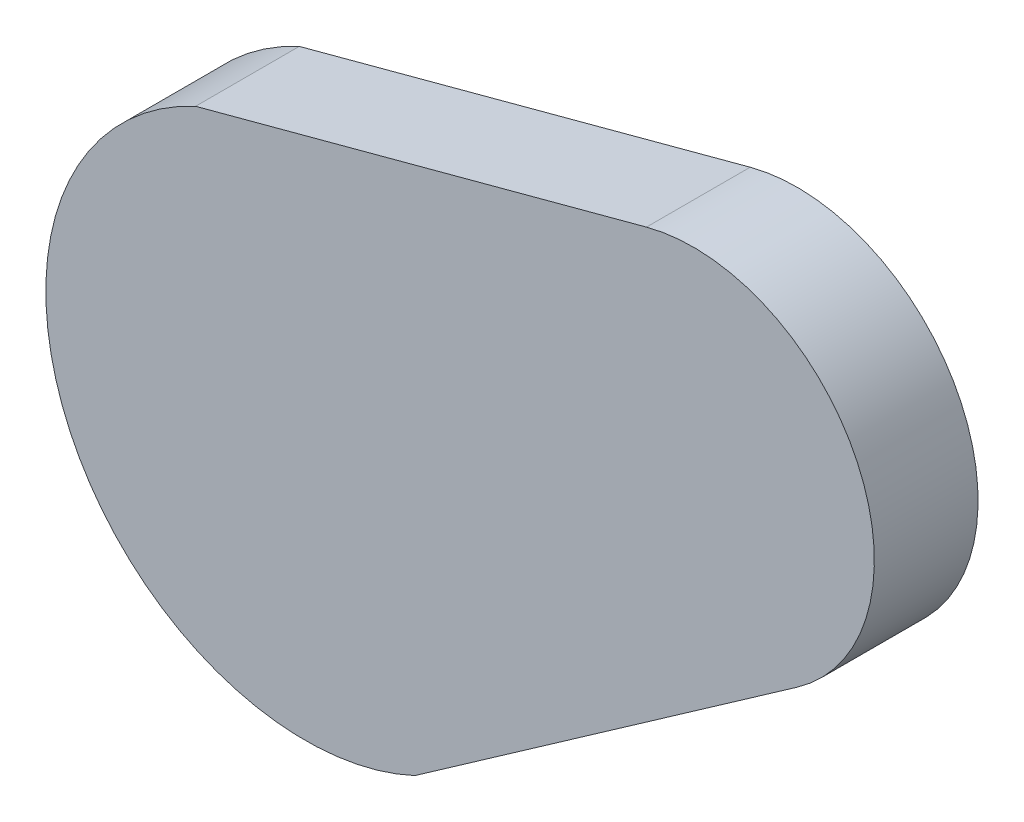
ISO-10303-21;
HEADER;
FILE_DESCRIPTION(('STEP AP214'),'2;1');
FILE_NAME('part.step','',(''),(''),'','','');
FILE_SCHEMA(('AUTOMOTIVE_DESIGN { 1 0 10303 214 1 1 1 1 }'));
ENDSEC;
DATA;
#1=APPLICATION_CONTEXT('core data for automotive mechanical design processes');
#2=APPLICATION_PROTOCOL_DEFINITION('international standard','automotive_design',2000,#1);
#3=PRODUCT_CONTEXT('',#1,'mechanical');
#4=PRODUCT('Part','Part','',(#3));
#5=PRODUCT_RELATED_PRODUCT_CATEGORY('part','',(#4));
#6=PRODUCT_DEFINITION_FORMATION('','',#4);
#7=PRODUCT_DEFINITION_CONTEXT('part definition',#1,'design');
#8=PRODUCT_DEFINITION('design','',#6,#7);
#9=PRODUCT_DEFINITION_SHAPE('','',#8);
#10=(LENGTH_UNIT() NAMED_UNIT(*) SI_UNIT(.MILLI.,.METRE.));
#11=(NAMED_UNIT(*) PLANE_ANGLE_UNIT() SI_UNIT($,.RADIAN.));
#12=(NAMED_UNIT(*) SI_UNIT($,.STERADIAN.) SOLID_ANGLE_UNIT());
#13=UNCERTAINTY_MEASURE_WITH_UNIT(LENGTH_MEASURE(1.E-05),#10,'distance_accuracy_value','');
#14=(GEOMETRIC_REPRESENTATION_CONTEXT(3) GLOBAL_UNCERTAINTY_ASSIGNED_CONTEXT((#13)) GLOBAL_UNIT_ASSIGNED_CONTEXT((#10,
#11,#12)) REPRESENTATION_CONTEXT('',''));
#15=CARTESIAN_POINT('',(0.,0.,0.));
#16=DIRECTION('',(0.,0.,1.));
#17=DIRECTION('',(1.,0.,0.));
#18=AXIS2_PLACEMENT_3D('',#15,#16,#17);
#19=CARTESIAN_POINT('',(0.,-80.,20.));
#20=DIRECTION('',(0.,0.,-1.));
#21=DIRECTION('',(-1.,0.,0.));
#22=AXIS2_PLACEMENT_3D('',#19,#20,#21);
#23=CYLINDRICAL_SURFACE('',#22,25.);
#24=CARTESIAN_POINT('',(0.,-80.,10.));
#25=DIRECTION('',(0.,0.,1.));
#26=DIRECTION('',(-1.,0.,0.));
#27=AXIS2_PLACEMENT_3D('',#24,#25,#26);
#28=CIRCLE('',#27,25.);
#29=CARTESIAN_POINT('',(-10.5654565435175,-57.3423053240838,10.));
#30=VERTEX_POINT('',#29);
#31=CARTESIAN_POINT('',(10.5654565435175,-102.657694675916,10.));
#32=VERTEX_POINT('',#31);
#33=EDGE_CURVE('E98',#30,#32,#28,.T.);
#34=ORIENTED_EDGE('',*,*,#33,.T.);
#35=DIRECTION('',(0.,0.,-1.));
#36=VECTOR('',#35,1.);
#37=CARTESIAN_POINT('',(10.5654565435175,-102.657694675916,20.));
#38=LINE('',#37,#36);
#39=CARTESIAN_POINT('',(10.5654565435175,-102.657694675916,20.));
#40=VERTEX_POINT('',#39);
#41=EDGE_CURVE('E11',#40,#32,#38,.T.);
#42=ORIENTED_EDGE('',*,*,#41,.F.);
#43=CARTESIAN_POINT('',(0.,-80.,20.));
#44=DIRECTION('',(0.,0.,1.));
#45=DIRECTION('',(-1.,0.,0.));
#46=AXIS2_PLACEMENT_3D('',#43,#44,#45);
#47=CIRCLE('',#46,25.);
#48=CARTESIAN_POINT('',(-10.5654565435175,-57.3423053240838,20.));
#49=VERTEX_POINT('',#48);
#50=EDGE_CURVE('E86',#49,#40,#47,.T.);
#51=ORIENTED_EDGE('',*,*,#50,.F.);
#52=DIRECTION('',(0.,0.,-1.));
#53=VECTOR('',#52,1.);
#54=CARTESIAN_POINT('',(-10.5654565435175,-57.3423053240838,20.));
#55=LINE('',#54,#53);
#56=EDGE_CURVE('E94',#49,#30,#55,.T.);
#57=ORIENTED_EDGE('',*,*,#56,.T.);
#58=EDGE_LOOP('',(#34,#42,#51,#57));
#59=FACE_BOUND('',#58,.T.);
#60=ADVANCED_FACE('F35',(#59),#23,.T.);
#61=CARTESIAN_POINT('',(10.5654565435175,-102.657694675916,20.));
#62=DIRECTION('',(-0.573576436351051,0.819152044288988,0.));
#63=DIRECTION('',(-0.819152044288988,-0.573576436351051,0.));
#64=AXIS2_PLACEMENT_3D('',#61,#62,#63);
#65=PLANE('',#64);
#66=DIRECTION('',(0.819152044288988,0.573576436351051,0.));
#67=VECTOR('',#66,1.);
#68=CARTESIAN_POINT('',(10.5654565435175,-102.657694675916,10.));
#69=LINE('',#68,#67);
#70=CARTESIAN_POINT('',(47.427298536522,-76.8467550401189,10.));
#71=VERTEX_POINT('',#70);
#72=EDGE_CURVE('E90',#32,#71,#69,.T.);
#73=ORIENTED_EDGE('',*,*,#72,.T.);
#74=DIRECTION('',(0.,0.,-1.));
#75=VECTOR('',#74,1.);
#76=CARTESIAN_POINT('',(47.427298536522,-76.8467550401189,20.));
#77=LINE('',#76,#75);
#78=CARTESIAN_POINT('',(47.427298536522,-76.8467550401189,20.));
#79=VERTEX_POINT('',#78);
#80=EDGE_CURVE('E43',#79,#71,#77,.T.);
#81=ORIENTED_EDGE('',*,*,#80,.F.);
#82=DIRECTION('',(0.819152044288988,0.573576436351051,0.));
#83=VECTOR('',#82,1.);
#84=CARTESIAN_POINT('',(10.5654565435175,-102.657694675916,20.));
#85=LINE('',#84,#83);
#86=EDGE_CURVE('E81',#40,#79,#85,.T.);
#87=ORIENTED_EDGE('',*,*,#86,.F.);
#88=ORIENTED_EDGE('',*,*,#41,.T.);
#89=EDGE_LOOP('',(#73,#81,#87,#88));
#90=FACE_BOUND('',#89,.T.);
#91=ADVANCED_FACE('F89',(#90),#65,.F.);
#92=CARTESIAN_POINT('',(37.4178441562144,-62.5517727183067,20.));
#93=DIRECTION('',(0.,0.,-1.));
#94=DIRECTION('',(-1.,0.,0.));
#95=AXIS2_PLACEMENT_3D('',#92,#93,#94);
#96=CYLINDRICAL_SURFACE('',#95,17.4509511652627);
#97=CARTESIAN_POINT('',(37.4178441562144,-62.5517727183067,10.));
#98=DIRECTION('',(0.,0.,1.));
#99=DIRECTION('',(1.,0.,0.));
#100=AXIS2_PLACEMENT_3D('',#97,#98,#99);
#101=CIRCLE('',#100,17.4509511652627);
#102=CARTESIAN_POINT('',(32.9012056394903,-45.6954482944702,10.));
#103=VERTEX_POINT('',#102);
#104=EDGE_CURVE('E68',#71,#103,#101,.T.);
#105=ORIENTED_EDGE('',*,*,#104,.T.);
#106=DIRECTION('',(0.,0.,-1.));
#107=VECTOR('',#106,1.);
#108=CARTESIAN_POINT('',(32.9012056394903,-45.6954482944702,20.));
#109=LINE('',#108,#107);
#110=CARTESIAN_POINT('',(32.9012056394903,-45.6954482944702,20.));
#111=VERTEX_POINT('',#110);
#112=EDGE_CURVE('E91',#111,#103,#109,.T.);
#113=ORIENTED_EDGE('',*,*,#112,.F.);
#114=CARTESIAN_POINT('',(37.4178441562144,-62.5517727183067,20.));
#115=DIRECTION('',(0.,0.,1.));
#116=DIRECTION('',(1.,0.,0.));
#117=AXIS2_PLACEMENT_3D('',#114,#115,#116);
#118=CIRCLE('',#117,17.4509511652627);
#119=EDGE_CURVE('E84',#79,#111,#118,.T.);
#120=ORIENTED_EDGE('',*,*,#119,.F.);
#121=ORIENTED_EDGE('',*,*,#80,.T.);
#122=EDGE_LOOP('',(#105,#113,#120,#121));
#123=FACE_BOUND('',#122,.T.);
#124=ADVANCED_FACE('F92',(#123),#96,.T.);
#125=CARTESIAN_POINT('',(-10.5654565435175,-57.3423053240838,20.));
#126=DIRECTION('',(0.258819045102525,-0.965925826289067,0.));
#127=DIRECTION('',(0.965925826289067,0.258819045102525,0.));
#128=AXIS2_PLACEMENT_3D('',#125,#126,#127);
#129=PLANE('',#128);
#130=DIRECTION('',(-0.965925826289067,-0.258819045102525,0.));
#131=VECTOR('',#130,1.);
#132=CARTESIAN_POINT('',(-10.5654565435175,-57.3423053240838,10.));
#133=LINE('',#132,#131);
#134=EDGE_CURVE('E74',#103,#30,#133,.T.);
#135=ORIENTED_EDGE('',*,*,#134,.T.);
#136=ORIENTED_EDGE('',*,*,#56,.F.);
#137=DIRECTION('',(-0.965925826289067,-0.258819045102525,0.));
#138=VECTOR('',#137,1.);
#139=CARTESIAN_POINT('',(-10.5654565435175,-57.3423053240838,20.));
#140=LINE('',#139,#138);
#141=EDGE_CURVE('E51',#111,#49,#140,.T.);
#142=ORIENTED_EDGE('',*,*,#141,.F.);
#143=ORIENTED_EDGE('',*,*,#112,.T.);
#144=EDGE_LOOP('',(#135,#136,#142,#143));
#145=FACE_BOUND('',#144,.T.);
#146=ADVANCED_FACE('F105',(#145),#129,.F.);
#147=CARTESIAN_POINT('',(0.,-80.,20.));
#148=DIRECTION('',(0.,0.,-1.));
#149=DIRECTION('',(-1.,0.,0.));
#150=AXIS2_PLACEMENT_3D('',#147,#148,#149);
#151=PLANE('',#150);
#152=ORIENTED_EDGE('',*,*,#50,.T.);
#153=ORIENTED_EDGE('',*,*,#86,.T.);
#154=ORIENTED_EDGE('',*,*,#119,.T.);
#155=ORIENTED_EDGE('',*,*,#141,.T.);
#156=EDGE_LOOP('',(#152,#153,#154,#155));
#157=FACE_BOUND('',#156,.T.);
#158=ADVANCED_FACE('F82',(#157),#151,.F.);
#159=CARTESIAN_POINT('',(0.,-80.,10.));
#160=DIRECTION('',(0.,0.,-1.));
#161=DIRECTION('',(-1.,0.,0.));
#162=AXIS2_PLACEMENT_3D('',#159,#160,#161);
#163=PLANE('',#162);
#164=ORIENTED_EDGE('',*,*,#33,.F.);
#165=ORIENTED_EDGE('',*,*,#134,.F.);
#166=ORIENTED_EDGE('',*,*,#104,.F.);
#167=ORIENTED_EDGE('',*,*,#72,.F.);
#168=EDGE_LOOP('',(#164,#165,#166,#167));
#169=FACE_BOUND('',#168,.T.);
#170=ADVANCED_FACE('F108',(#169),#163,.T.);
#171=CLOSED_SHELL('',(#60,#91,#124,#146,#158,#170));
#172=MANIFOLD_SOLID_BREP('B2',#171);
#173=ADVANCED_BREP_SHAPE_REPRESENTATION('',(#18,#172),#14);
#174=SHAPE_DEFINITION_REPRESENTATION(#9,#173);
ENDSEC;
END-ISO-10303-21;
